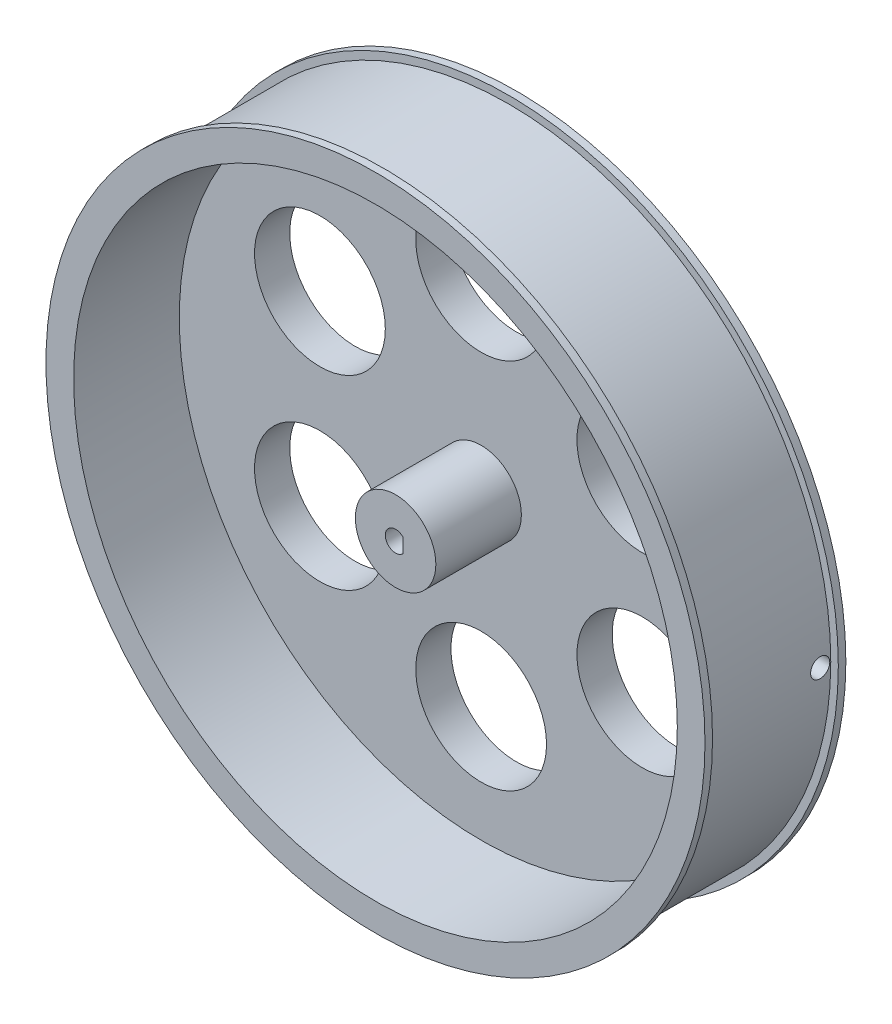
ISO-10303-21;
HEADER;
FILE_DESCRIPTION(('STEP AP214'),'2;1');
FILE_NAME('part.step','',(''),(''),'','','');
FILE_SCHEMA(('AUTOMOTIVE_DESIGN { 1 0 10303 214 1 1 1 1 }'));
ENDSEC;
DATA;
#1=APPLICATION_CONTEXT('core data for automotive mechanical design processes');
#2=APPLICATION_PROTOCOL_DEFINITION('international standard','automotive_design',2000,#1);
#3=PRODUCT_CONTEXT('',#1,'mechanical');
#4=PRODUCT('Part','Part','',(#3));
#5=PRODUCT_RELATED_PRODUCT_CATEGORY('part','',(#4));
#6=PRODUCT_DEFINITION_FORMATION('','',#4);
#7=PRODUCT_DEFINITION_CONTEXT('part definition',#1,'design');
#8=PRODUCT_DEFINITION('design','',#6,#7);
#9=PRODUCT_DEFINITION_SHAPE('','',#8);
#10=(LENGTH_UNIT() NAMED_UNIT(*) SI_UNIT(.MILLI.,.METRE.));
#11=(NAMED_UNIT(*) PLANE_ANGLE_UNIT() SI_UNIT($,.RADIAN.));
#12=(NAMED_UNIT(*) SI_UNIT($,.STERADIAN.) SOLID_ANGLE_UNIT());
#13=UNCERTAINTY_MEASURE_WITH_UNIT(LENGTH_MEASURE(1.E-05),#10,'distance_accuracy_value','');
#14=(GEOMETRIC_REPRESENTATION_CONTEXT(3) GLOBAL_UNCERTAINTY_ASSIGNED_CONTEXT((#13)) GLOBAL_UNIT_ASSIGNED_CONTEXT((#10,
#11,#12)) REPRESENTATION_CONTEXT('',''));
#15=CARTESIAN_POINT('',(0.,0.,0.));
#16=DIRECTION('',(0.,0.,1.));
#17=DIRECTION('',(1.,0.,0.));
#18=AXIS2_PLACEMENT_3D('',#15,#16,#17);
#19=CARTESIAN_POINT('',(0.,0.,28.));
#20=DIRECTION('',(0.,0.,-1.));
#21=DIRECTION('',(-1.,0.,0.));
#22=AXIS2_PLACEMENT_3D('',#19,#20,#21);
#23=CYLINDRICAL_SURFACE('',#22,64.);
#24=CARTESIAN_POINT('',(0.,0.,1.5));
#25=DIRECTION('',(0.,0.,1.));
#26=DIRECTION('',(1.,0.,0.));
#27=AXIS2_PLACEMENT_3D('',#24,#25,#26);
#28=CIRCLE('',#27,64.);
#29=CARTESIAN_POINT('',(64.,0.,1.5));
#30=VERTEX_POINT('',#29);
#31=EDGE_CURVE('E115',#30,#30,#28,.T.);
#32=ORIENTED_EDGE('',*,*,#31,.T.);
#33=EDGE_LOOP('',(#32));
#34=FACE_BOUND('',#33,.T.);
#35=CARTESIAN_POINT('',(0.,0.,26.5));
#36=DIRECTION('',(0.,0.,1.));
#37=DIRECTION('',(1.,0.,0.));
#38=AXIS2_PLACEMENT_3D('',#35,#36,#37);
#39=CIRCLE('',#38,64.);
#40=CARTESIAN_POINT('',(64.,0.,26.5));
#41=VERTEX_POINT('',#40);
#42=EDGE_CURVE('E116',#41,#41,#39,.T.);
#43=ORIENTED_EDGE('',*,*,#42,.F.);
#44=EDGE_LOOP('',(#43));
#45=FACE_BOUND('',#44,.T.);
#46=CARTESIAN_POINT('',(64.,0.,5.5));
#47=CARTESIAN_POINT('',(63.9999996199994,-0.106698612345607,5.49999527608061));
#48=CARTESIAN_POINT('',(63.9997303111057,-0.213473992693703,5.49098199431522));
#49=CARTESIAN_POINT('',(63.9986818741941,-0.424082374028197,5.45515226980288));
#50=CARTESIAN_POINT('',(63.9979021371134,-0.527911705051908,5.42831455769016));
#51=CARTESIAN_POINT('',(63.9959211475545,-0.72954643512145,5.35760220562604));
#52=CARTESIAN_POINT('',(63.9947201012045,-0.827354752525751,5.31373589589952));
#53=CARTESIAN_POINT('',(63.992031970981,-1.01419188196472,5.21022348904253));
#54=CARTESIAN_POINT('',(63.9905449569841,-1.10322283074151,5.15058124545399));
#55=CARTESIAN_POINT('',(63.9874515815209,-1.27004538019352,5.01717851573469));
#56=CARTESIAN_POINT('',(63.9858451749512,-1.34783270032114,4.94341267734249));
#57=CARTESIAN_POINT('',(63.9826944645377,-1.48992390514263,4.78386598718598));
#58=CARTESIAN_POINT('',(63.9811501631684,-1.5542272529904,4.69808465726786));
#59=CARTESIAN_POINT('',(63.9782975894916,-1.66753171355214,4.51692630096137));
#60=CARTESIAN_POINT('',(63.9769893564606,-1.71653028087621,4.42154768189913));
#61=CARTESIAN_POINT('',(63.9747568535961,-1.79781771133189,4.22391355579053));
#62=CARTESIAN_POINT('',(63.9738325822384,-1.83010664079925,4.1216580760465));
#63=CARTESIAN_POINT('',(63.9724725474494,-1.87704909606199,3.91320499276548));
#64=CARTESIAN_POINT('',(63.9720366391171,-1.89170785295673,3.80700856820308));
#65=CARTESIAN_POINT('',(63.9717020450109,-1.90298996714018,3.5936614448837));
#66=CARTESIAN_POINT('',(63.9718033571168,-1.89961339560664,3.48651074989449));
#67=CARTESIAN_POINT('',(63.9725316441729,-1.87492512980514,3.27433219245221));
#68=CARTESIAN_POINT('',(63.973158453323,-1.85361909247487,3.16930367113238));
#69=CARTESIAN_POINT('',(63.9748668133079,-1.793685444515,2.96431477686415));
#70=CARTESIAN_POINT('',(63.9759483651329,-1.75505779616508,2.86435441495292));
#71=CARTESIAN_POINT('',(63.9784444790023,-1.6615709348067,2.67232116840527));
#72=CARTESIAN_POINT('',(63.9798590942345,-1.60670912896074,2.58024954675));
#73=CARTESIAN_POINT('',(63.9828618091305,-1.48231321132906,2.40662122494208));
#74=CARTESIAN_POINT('',(63.9844499091809,-1.41277906683822,2.32506454822823));
#75=CARTESIAN_POINT('',(63.9876213051663,-1.26098029035961,2.17474825428561));
#76=CARTESIAN_POINT('',(63.9892045990093,-1.17871075242353,2.1059935912477));
#77=CARTESIAN_POINT('',(63.9921873051645,-1.00379383541694,1.98327117025075));
#78=CARTESIAN_POINT('',(63.9935867174473,-0.911146454671986,1.92930341467756));
#79=CARTESIAN_POINT('',(63.9960439274215,-0.718101037229735,1.83768732082399));
#80=CARTESIAN_POINT('',(63.9971017218578,-0.617702926688438,1.80003913804868));
#81=CARTESIAN_POINT('',(63.9987564024227,-0.412007241452619,1.74213405226947));
#82=CARTESIAN_POINT('',(63.9993532897805,-0.306709679823791,1.72187710289001));
#83=CARTESIAN_POINT('',(64.000018714961,-0.0942471702280073,1.69933557760619));
#84=CARTESIAN_POINT('',(64.0000874542976,0.0129170498759254,1.69704414699207));
#85=CARTESIAN_POINT('',(63.9996893685882,0.226108663191,1.71048084208262));
#86=CARTESIAN_POINT('',(63.9992225441496,0.332136057691051,1.72620894735491));
#87=CARTESIAN_POINT('',(63.9978060729454,0.540025161753835,1.77523257566562));
#88=CARTESIAN_POINT('',(63.9968565117124,0.641887605820601,1.80852498665189));
#89=CARTESIAN_POINT('',(63.9945815693909,0.838577839143948,1.89172901309807));
#90=CARTESIAN_POINT('',(63.9932561875643,0.933405614584978,1.94164066119583));
#91=CARTESIAN_POINT('',(63.9903784107815,1.11336623529374,2.05668399680052));
#92=CARTESIAN_POINT('',(63.9888259470702,1.19849613033198,2.12182029756429));
#93=CARTESIAN_POINT('',(63.9856691994091,1.35661482842624,2.26545717996146));
#94=CARTESIAN_POINT('',(63.9840649153291,1.42960360099844,2.34395779514886));
#95=CARTESIAN_POINT('',(63.9809848093217,1.56139104567387,2.51212432560449));
#96=CARTESIAN_POINT('',(63.9795090275302,1.62018529440946,2.60179370817698));
#97=CARTESIAN_POINT('',(63.9768529463871,1.72188448540472,2.78973467555335));
#98=CARTESIAN_POINT('',(63.9756726463773,1.76478946306328,2.88800624119227));
#99=CARTESIAN_POINT('',(63.9737408920934,1.83348445072033,3.09034534714766));
#100=CARTESIAN_POINT('',(63.972989366084,1.85927732374467,3.19441191474275));
#101=CARTESIAN_POINT('',(63.9719996911607,1.89302532388065,3.4054007473168));
#102=CARTESIAN_POINT('',(63.9717615418235,1.90098046569827,3.51232300994136));
#103=CARTESIAN_POINT('',(63.9718254969467,1.89882685216755,3.7259438002625));
#104=CARTESIAN_POINT('',(63.972127392715,1.88872507463918,3.83264239843933));
#105=CARTESIAN_POINT('',(63.9732369662478,1.85075872225259,4.04282849862724));
#106=CARTESIAN_POINT('',(63.9740446450153,1.82289411217036,4.14631599427022));
#107=CARTESIAN_POINT('',(63.9760747033709,1.7501940106501,4.34714497018357));
#108=CARTESIAN_POINT('',(63.9772970899118,1.70535823468446,4.44448634738018));
#109=CARTESIAN_POINT('',(63.9800187096145,1.5999909753816,4.63025806174355));
#110=CARTESIAN_POINT('',(63.9815179327465,1.53946006065691,4.71868872157179));
#111=CARTESIAN_POINT('',(63.9846247983773,1.40440041681556,4.88416073072506));
#112=CARTESIAN_POINT('',(63.9862324711014,1.32986777494589,4.96119888565792));
#113=CARTESIAN_POINT('',(63.9893751008632,1.16890523993306,5.10169011322));
#114=CARTESIAN_POINT('',(63.9909100397954,1.08247240521062,5.16513981701297));
#115=CARTESIAN_POINT('',(63.9937347008838,0.900129571652097,5.27666360279237));
#116=CARTESIAN_POINT('',(63.9950242643113,0.804213498837416,5.32472774578347));
#117=CARTESIAN_POINT('',(63.9972099587862,0.605743479037089,5.40401443328386));
#118=CARTESIAN_POINT('',(63.9981065588035,0.503197612887766,5.43525706313565));
#119=CARTESIAN_POINT('',(63.9991656406717,0.333336555604716,5.47173331156169));
#120=CARTESIAN_POINT('',(63.9994771680259,0.26712392271573,5.48231998426404));
#121=CARTESIAN_POINT('',(63.9998944669518,0.133950946908267,5.4964548104222));
#122=CARTESIAN_POINT('',(64.0000002385829,0.0669906042053914,5.5000029659075));
#123=CARTESIAN_POINT('',(64.,0.,5.5));
#124=B_SPLINE_CURVE_WITH_KNOTS('',3,(#46,#47,#48,#49,#50,#51,#52,#53,#54,#55,#56,#57,#58,#59,
#60,#61,#62,#63,#64,#65,#66,#67,#68,#69,#70,#71,#72,#73,#74,#75,#76,#77,#78,#79,#80,#81,#82,#83,
#84,#85,#86,#87,#88,#89,#90,#91,#92,#93,#94,#95,#96,#97,#98,#99,#100,#101,#102,#103,#104,#105,
#106,#107,#108,#109,#110,#111,#112,#113,#114,#115,#116,#117,#118,#119,#120,#121,#122,#123),
.UNSPECIFIED.,.T.,.F.,(4,2,2,2,2,2,2,2,2,2,2,2,2,2,2,2,2,2,2,2,2,2,2,2,2,2,2,2,2,2,2,2,2,2,2,2,
2,2,4),(0.,0.319851312799351,0.640084982098791,0.960162193204059,1.28016129205621,
1.6002818982838,1.92041524726091,2.24060181038508,2.56078710238796,2.88087736783342,
3.20096637002027,3.5209544185612,3.84094316392596,4.16098304388419,4.48102363722917,
4.80118782533059,5.12135206509002,5.44151935554613,5.76168579223955,6.08173006408592,
6.40177397303405,6.72176119548276,7.04174904634525,7.36183398344589,7.6819197242011,
8.00210508327793,8.32228972902593,8.64242079116892,8.96255158938567,9.28255870470103,
9.60256645459825,9.92257956977625,10.2425810929541,10.5626721732605,10.8828425186209,
11.2032192769713,11.523212643638,11.7240309898899,11.9248492782376),.UNSPECIFIED.);
#125=CARTESIAN_POINT('',(64.,0.,5.5));
#126=VERTEX_POINT('',#125);
#127=EDGE_CURVE('E43',#126,#126,#124,.T.);
#128=ORIENTED_EDGE('',*,*,#127,.F.);
#129=EDGE_LOOP('',(#128));
#130=FACE_BOUND('',#129,.T.);
#131=ADVANCED_FACE('F39',(#34,#45,#130),#23,.T.);
#132=CARTESIAN_POINT('',(9.,0.,3.6));
#133=DIRECTION('',(-1.,0.,0.));
#134=DIRECTION('',(0.,0.,1.));
#135=AXIS2_PLACEMENT_3D('',#132,#133,#134);
#136=CYLINDRICAL_SURFACE('',#135,1.3);
#137=CARTESIAN_POINT('',(1.5,0.,3.6));
#138=DIRECTION('',(-1.,0.,0.));
#139=DIRECTION('',(0.,-1.,0.));
#140=AXIS2_PLACEMENT_3D('',#137,#138,#139);
#141=CIRCLE('',#140,1.3);
#142=CARTESIAN_POINT('',(1.5,-1.3,3.6));
#143=VERTEX_POINT('',#142);
#144=EDGE_CURVE('E80',#143,#143,#141,.F.);
#145=ORIENTED_EDGE('',*,*,#144,.F.);
#146=EDGE_LOOP('',(#145));
#147=FACE_BOUND('',#146,.T.);
#148=CARTESIAN_POINT('',(8.5,0.,3.6));
#149=DIRECTION('',(1.,0.,0.));
#150=DIRECTION('',(0.,0.,-1.));
#151=AXIS2_PLACEMENT_3D('',#148,#149,#150);
#152=CIRCLE('',#151,1.3);
#153=CARTESIAN_POINT('',(8.5,0.,2.3));
#154=VERTEX_POINT('',#153);
#155=EDGE_CURVE('E120',#154,#154,#152,.T.);
#156=ORIENTED_EDGE('',*,*,#155,.T.);
#157=EDGE_LOOP('',(#156));
#158=FACE_BOUND('',#157,.T.);
#159=ADVANCED_FACE('F96',(#147,#158),#136,.F.);
#160=CARTESIAN_POINT('',(0.,0.,0.));
#161=DIRECTION('',(0.,0.,1.));
#162=DIRECTION('',(1.,0.,0.));
#163=AXIS2_PLACEMENT_3D('',#160,#161,#162);
#164=PLANE('',#163);
#165=CARTESIAN_POINT('',(0.,0.,0.));
#166=DIRECTION('',(0.,0.,1.));
#167=DIRECTION('',(1.,0.,0.));
#168=AXIS2_PLACEMENT_3D('',#165,#166,#167);
#169=CIRCLE('',#168,65.5);
#170=CARTESIAN_POINT('',(65.5,0.,0.));
#171=VERTEX_POINT('',#170);
#172=EDGE_CURVE('E170',#171,#171,#169,.T.);
#173=ORIENTED_EDGE('',*,*,#172,.F.);
#174=EDGE_LOOP('',(#173));
#175=FACE_BOUND('',#174,.T.);
#176=CARTESIAN_POINT('',(32.0429399400242,18.5,0.));
#177=DIRECTION('',(0.,0.,1.));
#178=DIRECTION('',(1.,0.,0.));
#179=AXIS2_PLACEMENT_3D('',#176,#177,#178);
#180=CIRCLE('',#179,13.);
#181=CARTESIAN_POINT('',(45.0429399400242,18.5,0.));
#182=VERTEX_POINT('',#181);
#183=EDGE_CURVE('E147',#182,#182,#180,.F.);
#184=ORIENTED_EDGE('',*,*,#183,.F.);
#185=EDGE_LOOP('',(#184));
#186=FACE_BOUND('',#185,.T.);
#187=CARTESIAN_POINT('',(0.,37.,0.));
#188=DIRECTION('',(0.,0.,1.));
#189=DIRECTION('',(1.,0.,0.));
#190=AXIS2_PLACEMENT_3D('',#187,#188,#189);
#191=CIRCLE('',#190,13.);
#192=CARTESIAN_POINT('',(13.,37.,0.));
#193=VERTEX_POINT('',#192);
#194=EDGE_CURVE('E148',#193,#193,#191,.F.);
#195=ORIENTED_EDGE('',*,*,#194,.F.);
#196=EDGE_LOOP('',(#195));
#197=FACE_BOUND('',#196,.T.);
#198=CARTESIAN_POINT('',(-32.0429399400242,18.5,0.));
#199=DIRECTION('',(0.,0.,1.));
#200=DIRECTION('',(1.,0.,0.));
#201=AXIS2_PLACEMENT_3D('',#198,#199,#200);
#202=CIRCLE('',#201,13.);
#203=CARTESIAN_POINT('',(-19.0429399400242,18.5,0.));
#204=VERTEX_POINT('',#203);
#205=EDGE_CURVE('E142',#204,#204,#202,.F.);
#206=ORIENTED_EDGE('',*,*,#205,.F.);
#207=EDGE_LOOP('',(#206));
#208=FACE_BOUND('',#207,.T.);
#209=CARTESIAN_POINT('',(-32.0429399400242,-18.5,0.));
#210=DIRECTION('',(0.,0.,1.));
#211=DIRECTION('',(1.,0.,0.));
#212=AXIS2_PLACEMENT_3D('',#209,#210,#211);
#213=CIRCLE('',#212,13.);
#214=CARTESIAN_POINT('',(-19.0429399400242,-18.5,0.));
#215=VERTEX_POINT('',#214);
#216=EDGE_CURVE('E140',#215,#215,#213,.F.);
#217=ORIENTED_EDGE('',*,*,#216,.F.);
#218=EDGE_LOOP('',(#217));
#219=FACE_BOUND('',#218,.T.);
#220=CARTESIAN_POINT('',(0.,-37.,0.));
#221=DIRECTION('',(0.,0.,1.));
#222=DIRECTION('',(1.,0.,0.));
#223=AXIS2_PLACEMENT_3D('',#220,#221,#222);
#224=CIRCLE('',#223,13.);
#225=CARTESIAN_POINT('',(13.,-37.,0.));
#226=VERTEX_POINT('',#225);
#227=EDGE_CURVE('E133',#226,#226,#224,.F.);
#228=ORIENTED_EDGE('',*,*,#227,.F.);
#229=EDGE_LOOP('',(#228));
#230=FACE_BOUND('',#229,.T.);
#231=CARTESIAN_POINT('',(32.0429399400242,-18.5,0.));
#232=DIRECTION('',(0.,0.,1.));
#233=DIRECTION('',(1.,0.,0.));
#234=AXIS2_PLACEMENT_3D('',#231,#232,#233);
#235=CIRCLE('',#234,13.);
#236=CARTESIAN_POINT('',(45.0429399400242,-18.5,0.));
#237=VERTEX_POINT('',#236);
#238=EDGE_CURVE('E134',#237,#237,#235,.F.);
#239=ORIENTED_EDGE('',*,*,#238,.F.);
#240=EDGE_LOOP('',(#239));
#241=FACE_BOUND('',#240,.T.);
#242=CARTESIAN_POINT('',(0.,0.,0.));
#243=DIRECTION('',(0.,0.,1.));
#244=DIRECTION('',(1.,0.,0.));
#245=AXIS2_PLACEMENT_3D('',#242,#243,#244);
#246=CIRCLE('',#245,2.05);
#247=CARTESIAN_POINT('',(1.5,-1.39731886124821,0.));
#248=VERTEX_POINT('',#247);
#249=CARTESIAN_POINT('',(1.5,1.39731886124821,0.));
#250=VERTEX_POINT('',#249);
#251=EDGE_CURVE('E79',#248,#250,#246,.F.);
#252=ORIENTED_EDGE('',*,*,#251,.F.);
#253=DIRECTION('',(0.,-1.,0.));
#254=VECTOR('',#253,1.);
#255=CARTESIAN_POINT('',(1.5,0.,0.));
#256=LINE('',#255,#254);
#257=EDGE_CURVE('E192',#250,#248,#256,.T.);
#258=ORIENTED_EDGE('',*,*,#257,.F.);
#259=EDGE_LOOP('',(#252,#258));
#260=FACE_BOUND('',#259,.T.);
#261=ADVANCED_FACE('F83',(#175,#186,#197,#208,#219,#230,#241,#260),#164,.F.);
#262=CARTESIAN_POINT('',(0.,0.,24.));
#263=DIRECTION('',(0.,0.,1.));
#264=DIRECTION('',(1.,0.,0.));
#265=AXIS2_PLACEMENT_3D('',#262,#263,#264);
#266=PLANE('',#265);
#267=CARTESIAN_POINT('',(0.,0.,24.));
#268=DIRECTION('',(0.,0.,1.));
#269=DIRECTION('',(1.,0.,0.));
#270=AXIS2_PLACEMENT_3D('',#267,#268,#269);
#271=CIRCLE('',#270,8.);
#272=CARTESIAN_POINT('',(8.,0.,24.));
#273=VERTEX_POINT('',#272);
#274=EDGE_CURVE('E158',#273,#273,#271,.T.);
#275=ORIENTED_EDGE('',*,*,#274,.T.);
#276=EDGE_LOOP('',(#275));
#277=FACE_BOUND('',#276,.T.);
#278=DIRECTION('',(0.,-1.,0.));
#279=VECTOR('',#278,1.);
#280=CARTESIAN_POINT('',(1.5,0.,24.));
#281=LINE('',#280,#279);
#282=CARTESIAN_POINT('',(1.5,1.39731886124821,24.));
#283=VERTEX_POINT('',#282);
#284=CARTESIAN_POINT('',(1.5,-1.39731886124821,24.));
#285=VERTEX_POINT('',#284);
#286=EDGE_CURVE('E55',#283,#285,#281,.T.);
#287=ORIENTED_EDGE('',*,*,#286,.T.);
#288=CARTESIAN_POINT('',(0.,0.,24.));
#289=DIRECTION('',(0.,0.,1.));
#290=DIRECTION('',(1.,0.,0.));
#291=AXIS2_PLACEMENT_3D('',#288,#289,#290);
#292=CIRCLE('',#291,2.05);
#293=EDGE_CURVE('E11',#285,#283,#292,.F.);
#294=ORIENTED_EDGE('',*,*,#293,.T.);
#295=EDGE_LOOP('',(#287,#294));
#296=FACE_BOUND('',#295,.T.);
#297=ADVANCED_FACE('F84',(#277,#296),#266,.T.);
#298=CARTESIAN_POINT('',(0.,0.,28.));
#299=DIRECTION('',(0.,0.,1.));
#300=DIRECTION('',(1.,0.,0.));
#301=AXIS2_PLACEMENT_3D('',#298,#299,#300);
#302=PLANE('',#301);
#303=CARTESIAN_POINT('',(0.,0.,28.));
#304=DIRECTION('',(0.,0.,1.));
#305=DIRECTION('',(1.,0.,0.));
#306=AXIS2_PLACEMENT_3D('',#303,#304,#305);
#307=CIRCLE('',#306,65.5);
#308=CARTESIAN_POINT('',(65.5,0.,28.));
#309=VERTEX_POINT('',#308);
#310=EDGE_CURVE('E168',#309,#309,#307,.T.);
#311=ORIENTED_EDGE('',*,*,#310,.T.);
#312=EDGE_LOOP('',(#311));
#313=FACE_BOUND('',#312,.T.);
#314=CARTESIAN_POINT('',(0.,0.,28.));
#315=DIRECTION('',(0.,0.,1.));
#316=DIRECTION('',(1.,0.,0.));
#317=AXIS2_PLACEMENT_3D('',#314,#315,#316);
#318=CIRCLE('',#317,60.);
#319=CARTESIAN_POINT('',(60.,0.,28.));
#320=VERTEX_POINT('',#319);
#321=EDGE_CURVE('E165',#320,#320,#318,.T.);
#322=ORIENTED_EDGE('',*,*,#321,.F.);
#323=EDGE_LOOP('',(#322));
#324=FACE_BOUND('',#323,.T.);
#325=ADVANCED_FACE('F81',(#313,#324),#302,.T.);
#326=CARTESIAN_POINT('',(0.,0.,28.));
#327=DIRECTION('',(0.,0.,-1.));
#328=DIRECTION('',(-1.,0.,0.));
#329=AXIS2_PLACEMENT_3D('',#326,#327,#328);
#330=CYLINDRICAL_SURFACE('',#329,60.);
#331=CARTESIAN_POINT('',(0.,0.,7.));
#332=DIRECTION('',(0.,0.,1.));
#333=DIRECTION('',(1.,0.,0.));
#334=AXIS2_PLACEMENT_3D('',#331,#332,#333);
#335=CIRCLE('',#334,60.);
#336=CARTESIAN_POINT('',(60.,0.,7.));
#337=VERTEX_POINT('',#336);
#338=EDGE_CURVE('E71',#337,#337,#335,.T.);
#339=ORIENTED_EDGE('',*,*,#338,.F.);
#340=EDGE_LOOP('',(#339));
#341=FACE_BOUND('',#340,.T.);
#342=ORIENTED_EDGE('',*,*,#321,.T.);
#343=EDGE_LOOP('',(#342));
#344=FACE_BOUND('',#343,.T.);
#345=ADVANCED_FACE('F91',(#341,#344),#330,.F.);
#346=CARTESIAN_POINT('',(0.,0.,1.5));
#347=DIRECTION('',(0.,0.,1.));
#348=DIRECTION('',(1.,0.,0.));
#349=AXIS2_PLACEMENT_3D('',#346,#347,#348);
#350=PLANE('',#349);
#351=ORIENTED_EDGE('',*,*,#31,.F.);
#352=EDGE_LOOP('',(#351));
#353=FACE_BOUND('',#352,.T.);
#354=CARTESIAN_POINT('',(0.,0.,1.5));
#355=DIRECTION('',(0.,0.,1.));
#356=DIRECTION('',(1.,0.,0.));
#357=AXIS2_PLACEMENT_3D('',#354,#355,#356);
#358=CIRCLE('',#357,65.5);
#359=CARTESIAN_POINT('',(65.5,0.,1.5));
#360=VERTEX_POINT('',#359);
#361=EDGE_CURVE('E163',#360,#360,#358,.T.);
#362=ORIENTED_EDGE('',*,*,#361,.T.);
#363=EDGE_LOOP('',(#362));
#364=FACE_BOUND('',#363,.T.);
#365=ADVANCED_FACE('F246',(#353,#364),#350,.T.);
#366=CARTESIAN_POINT('',(0.,0.,1.5));
#367=DIRECTION('',(0.,0.,-1.));
#368=DIRECTION('',(-1.,0.,0.));
#369=AXIS2_PLACEMENT_3D('',#366,#367,#368);
#370=CYLINDRICAL_SURFACE('',#369,65.5);
#371=ORIENTED_EDGE('',*,*,#361,.F.);
#372=EDGE_LOOP('',(#371));
#373=FACE_BOUND('',#372,.T.);
#374=ORIENTED_EDGE('',*,*,#172,.T.);
#375=EDGE_LOOP('',(#374));
#376=FACE_BOUND('',#375,.T.);
#377=ADVANCED_FACE('F260',(#373,#376),#370,.T.);
#378=CARTESIAN_POINT('',(0.,0.,26.5));
#379=DIRECTION('',(0.,0.,1.));
#380=DIRECTION('',(1.,0.,0.));
#381=AXIS2_PLACEMENT_3D('',#378,#379,#380);
#382=PLANE('',#381);
#383=ORIENTED_EDGE('',*,*,#42,.T.);
#384=EDGE_LOOP('',(#383));
#385=FACE_BOUND('',#384,.T.);
#386=CARTESIAN_POINT('',(0.,0.,26.5));
#387=DIRECTION('',(0.,0.,1.));
#388=DIRECTION('',(1.,0.,0.));
#389=AXIS2_PLACEMENT_3D('',#386,#387,#388);
#390=CIRCLE('',#389,65.5);
#391=CARTESIAN_POINT('',(65.5,0.,26.5));
#392=VERTEX_POINT('',#391);
#393=EDGE_CURVE('E160',#392,#392,#390,.T.);
#394=ORIENTED_EDGE('',*,*,#393,.F.);
#395=EDGE_LOOP('',(#394));
#396=FACE_BOUND('',#395,.T.);
#397=ADVANCED_FACE('F265',(#385,#396),#382,.F.);
#398=CARTESIAN_POINT('',(0.,0.,28.));
#399=DIRECTION('',(0.,0.,-1.));
#400=DIRECTION('',(-1.,0.,0.));
#401=AXIS2_PLACEMENT_3D('',#398,#399,#400);
#402=CYLINDRICAL_SURFACE('',#401,65.5);
#403=ORIENTED_EDGE('',*,*,#310,.F.);
#404=EDGE_LOOP('',(#403));
#405=FACE_BOUND('',#404,.T.);
#406=ORIENTED_EDGE('',*,*,#393,.T.);
#407=EDGE_LOOP('',(#406));
#408=FACE_BOUND('',#407,.T.);
#409=ADVANCED_FACE('F238',(#405,#408),#402,.T.);
#410=CARTESIAN_POINT('',(0.,0.,7.));
#411=DIRECTION('',(0.,0.,1.));
#412=DIRECTION('',(1.,0.,0.));
#413=AXIS2_PLACEMENT_3D('',#410,#411,#412);
#414=PLANE('',#413);
#415=CARTESIAN_POINT('',(32.0429399400242,-18.5,7.));
#416=DIRECTION('',(0.,0.,1.));
#417=DIRECTION('',(1.,0.,0.));
#418=AXIS2_PLACEMENT_3D('',#415,#416,#417);
#419=CIRCLE('',#418,13.);
#420=CARTESIAN_POINT('',(45.0429399400242,-18.5,7.));
#421=VERTEX_POINT('',#420);
#422=EDGE_CURVE('E128',#421,#421,#419,.F.);
#423=ORIENTED_EDGE('',*,*,#422,.T.);
#424=EDGE_LOOP('',(#423));
#425=FACE_BOUND('',#424,.T.);
#426=CARTESIAN_POINT('',(0.,-37.,7.));
#427=DIRECTION('',(0.,0.,1.));
#428=DIRECTION('',(1.,0.,0.));
#429=AXIS2_PLACEMENT_3D('',#426,#427,#428);
#430=CIRCLE('',#429,13.);
#431=CARTESIAN_POINT('',(13.,-37.,7.));
#432=VERTEX_POINT('',#431);
#433=EDGE_CURVE('E135',#432,#432,#430,.F.);
#434=ORIENTED_EDGE('',*,*,#433,.T.);
#435=EDGE_LOOP('',(#434));
#436=FACE_BOUND('',#435,.T.);
#437=CARTESIAN_POINT('',(-32.0429399400242,-18.5,7.));
#438=DIRECTION('',(0.,0.,1.));
#439=DIRECTION('',(1.,0.,0.));
#440=AXIS2_PLACEMENT_3D('',#437,#438,#439);
#441=CIRCLE('',#440,13.);
#442=CARTESIAN_POINT('',(-19.0429399400242,-18.5,7.));
#443=VERTEX_POINT('',#442);
#444=EDGE_CURVE('E136',#443,#443,#441,.F.);
#445=ORIENTED_EDGE('',*,*,#444,.T.);
#446=EDGE_LOOP('',(#445));
#447=FACE_BOUND('',#446,.T.);
#448=CARTESIAN_POINT('',(-32.0429399400242,18.5,7.));
#449=DIRECTION('',(0.,0.,1.));
#450=DIRECTION('',(1.,0.,0.));
#451=AXIS2_PLACEMENT_3D('',#448,#449,#450);
#452=CIRCLE('',#451,13.);
#453=CARTESIAN_POINT('',(-19.0429399400242,18.5,7.));
#454=VERTEX_POINT('',#453);
#455=EDGE_CURVE('E141',#454,#454,#452,.F.);
#456=ORIENTED_EDGE('',*,*,#455,.T.);
#457=EDGE_LOOP('',(#456));
#458=FACE_BOUND('',#457,.T.);
#459=CARTESIAN_POINT('',(0.,37.,7.));
#460=DIRECTION('',(0.,0.,1.));
#461=DIRECTION('',(1.,0.,0.));
#462=AXIS2_PLACEMENT_3D('',#459,#460,#461);
#463=CIRCLE('',#462,13.);
#464=CARTESIAN_POINT('',(13.,37.,7.));
#465=VERTEX_POINT('',#464);
#466=EDGE_CURVE('E150',#465,#465,#463,.F.);
#467=ORIENTED_EDGE('',*,*,#466,.T.);
#468=EDGE_LOOP('',(#467));
#469=FACE_BOUND('',#468,.T.);
#470=CARTESIAN_POINT('',(32.0429399400242,18.5,7.));
#471=DIRECTION('',(0.,0.,1.));
#472=DIRECTION('',(1.,0.,0.));
#473=AXIS2_PLACEMENT_3D('',#470,#471,#472);
#474=CIRCLE('',#473,13.);
#475=CARTESIAN_POINT('',(45.0429399400242,18.5,7.));
#476=VERTEX_POINT('',#475);
#477=EDGE_CURVE('E151',#476,#476,#474,.F.);
#478=ORIENTED_EDGE('',*,*,#477,.T.);
#479=EDGE_LOOP('',(#478));
#480=FACE_BOUND('',#479,.T.);
#481=CARTESIAN_POINT('',(0.,0.,7.));
#482=DIRECTION('',(0.,0.,1.));
#483=DIRECTION('',(1.,0.,0.));
#484=AXIS2_PLACEMENT_3D('',#481,#482,#483);
#485=CIRCLE('',#484,8.);
#486=CARTESIAN_POINT('',(8.,0.,7.));
#487=VERTEX_POINT('',#486);
#488=EDGE_CURVE('E152',#487,#487,#485,.F.);
#489=ORIENTED_EDGE('',*,*,#488,.T.);
#490=EDGE_LOOP('',(#489));
#491=FACE_BOUND('',#490,.T.);
#492=ORIENTED_EDGE('',*,*,#338,.T.);
#493=EDGE_LOOP('',(#492));
#494=FACE_BOUND('',#493,.T.);
#495=ADVANCED_FACE('F233',(#425,#436,#447,#458,#469,#480,#491,#494),#414,.T.);
#496=CARTESIAN_POINT('',(0.,0.,24.));
#497=DIRECTION('',(0.,0.,-1.));
#498=DIRECTION('',(-1.,0.,0.));
#499=AXIS2_PLACEMENT_3D('',#496,#497,#498);
#500=CYLINDRICAL_SURFACE('',#499,8.);
#501=ORIENTED_EDGE('',*,*,#488,.F.);
#502=EDGE_LOOP('',(#501));
#503=FACE_BOUND('',#502,.T.);
#504=ORIENTED_EDGE('',*,*,#274,.F.);
#505=EDGE_LOOP('',(#504));
#506=FACE_BOUND('',#505,.T.);
#507=ADVANCED_FACE('F223',(#503,#506),#500,.T.);
#508=CARTESIAN_POINT('',(32.0429399400242,18.5,8.));
#509=DIRECTION('',(0.,0.,-1.));
#510=DIRECTION('',(-1.,0.,0.));
#511=AXIS2_PLACEMENT_3D('',#508,#509,#510);
#512=CYLINDRICAL_SURFACE('',#511,13.);
#513=ORIENTED_EDGE('',*,*,#477,.F.);
#514=EDGE_LOOP('',(#513));
#515=FACE_BOUND('',#514,.T.);
#516=ORIENTED_EDGE('',*,*,#183,.T.);
#517=EDGE_LOOP('',(#516));
#518=FACE_BOUND('',#517,.T.);
#519=ADVANCED_FACE('F198',(#515,#518),#512,.F.);
#520=CARTESIAN_POINT('',(0.,37.,8.));
#521=DIRECTION('',(0.,0.,-1.));
#522=DIRECTION('',(-1.,0.,0.));
#523=AXIS2_PLACEMENT_3D('',#520,#521,#522);
#524=CYLINDRICAL_SURFACE('',#523,13.);
#525=ORIENTED_EDGE('',*,*,#466,.F.);
#526=EDGE_LOOP('',(#525));
#527=FACE_BOUND('',#526,.T.);
#528=ORIENTED_EDGE('',*,*,#194,.T.);
#529=EDGE_LOOP('',(#528));
#530=FACE_BOUND('',#529,.T.);
#531=ADVANCED_FACE('F221',(#527,#530),#524,.F.);
#532=CARTESIAN_POINT('',(-32.0429399400242,18.5,8.));
#533=DIRECTION('',(0.,0.,-1.));
#534=DIRECTION('',(-1.,0.,0.));
#535=AXIS2_PLACEMENT_3D('',#532,#533,#534);
#536=CYLINDRICAL_SURFACE('',#535,13.);
#537=ORIENTED_EDGE('',*,*,#455,.F.);
#538=EDGE_LOOP('',(#537));
#539=FACE_BOUND('',#538,.T.);
#540=ORIENTED_EDGE('',*,*,#205,.T.);
#541=EDGE_LOOP('',(#540));
#542=FACE_BOUND('',#541,.T.);
#543=ADVANCED_FACE('F232',(#539,#542),#536,.F.);
#544=CARTESIAN_POINT('',(-32.0429399400242,-18.5,8.));
#545=DIRECTION('',(0.,0.,-1.));
#546=DIRECTION('',(-1.,0.,0.));
#547=AXIS2_PLACEMENT_3D('',#544,#545,#546);
#548=CYLINDRICAL_SURFACE('',#547,13.);
#549=ORIENTED_EDGE('',*,*,#444,.F.);
#550=EDGE_LOOP('',(#549));
#551=FACE_BOUND('',#550,.T.);
#552=ORIENTED_EDGE('',*,*,#216,.T.);
#553=EDGE_LOOP('',(#552));
#554=FACE_BOUND('',#553,.T.);
#555=ADVANCED_FACE('F217',(#551,#554),#548,.F.);
#556=CARTESIAN_POINT('',(0.,-37.,8.));
#557=DIRECTION('',(0.,0.,-1.));
#558=DIRECTION('',(-1.,0.,0.));
#559=AXIS2_PLACEMENT_3D('',#556,#557,#558);
#560=CYLINDRICAL_SURFACE('',#559,13.);
#561=ORIENTED_EDGE('',*,*,#433,.F.);
#562=EDGE_LOOP('',(#561));
#563=FACE_BOUND('',#562,.T.);
#564=ORIENTED_EDGE('',*,*,#227,.T.);
#565=EDGE_LOOP('',(#564));
#566=FACE_BOUND('',#565,.T.);
#567=ADVANCED_FACE('F211',(#563,#566),#560,.F.);
#568=CARTESIAN_POINT('',(32.0429399400242,-18.5,8.));
#569=DIRECTION('',(0.,0.,-1.));
#570=DIRECTION('',(-1.,0.,0.));
#571=AXIS2_PLACEMENT_3D('',#568,#569,#570);
#572=CYLINDRICAL_SURFACE('',#571,13.);
#573=ORIENTED_EDGE('',*,*,#422,.F.);
#574=EDGE_LOOP('',(#573));
#575=FACE_BOUND('',#574,.T.);
#576=ORIENTED_EDGE('',*,*,#238,.T.);
#577=EDGE_LOOP('',(#576));
#578=FACE_BOUND('',#577,.T.);
#579=ADVANCED_FACE('F207',(#575,#578),#572,.F.);
#580=CARTESIAN_POINT('',(0.,0.,29.));
#581=DIRECTION('',(0.,0.,-1.));
#582=DIRECTION('',(-1.,0.,0.));
#583=AXIS2_PLACEMENT_3D('',#580,#581,#582);
#584=CYLINDRICAL_SURFACE('',#583,2.05);
#585=ORIENTED_EDGE('',*,*,#251,.T.);
#586=DIRECTION('',(0.,0.,-1.));
#587=VECTOR('',#586,1.);
#588=CARTESIAN_POINT('',(1.5,1.39731886124821,29.));
#589=LINE('',#588,#587);
#590=EDGE_CURVE('E58',#283,#250,#589,.T.);
#591=ORIENTED_EDGE('',*,*,#590,.F.);
#592=ORIENTED_EDGE('',*,*,#293,.F.);
#593=DIRECTION('',(0.,0.,-1.));
#594=VECTOR('',#593,1.);
#595=CARTESIAN_POINT('',(1.5,-1.39731886124821,29.));
#596=LINE('',#595,#594);
#597=EDGE_CURVE('E65',#285,#248,#596,.T.);
#598=ORIENTED_EDGE('',*,*,#597,.T.);
#599=EDGE_LOOP('',(#585,#591,#592,#598));
#600=FACE_BOUND('',#599,.T.);
#601=ADVANCED_FACE('F76',(#600),#584,.F.);
#602=CARTESIAN_POINT('',(1.5,-1.39731886124821,29.));
#603=DIRECTION('',(-1.,0.,0.));
#604=DIRECTION('',(0.,-1.,0.));
#605=AXIS2_PLACEMENT_3D('',#602,#603,#604);
#606=PLANE('',#605);
#607=ORIENTED_EDGE('',*,*,#144,.T.);
#608=EDGE_LOOP('',(#607));
#609=FACE_BOUND('',#608,.T.);
#610=ORIENTED_EDGE('',*,*,#257,.T.);
#611=ORIENTED_EDGE('',*,*,#597,.F.);
#612=ORIENTED_EDGE('',*,*,#286,.F.);
#613=ORIENTED_EDGE('',*,*,#590,.T.);
#614=EDGE_LOOP('',(#610,#611,#612,#613));
#615=FACE_BOUND('',#614,.T.);
#616=ADVANCED_FACE('F72',(#609,#615),#606,.T.);
#617=CARTESIAN_POINT('',(66.,0.,3.6));
#618=DIRECTION('',(-1.,0.,0.));
#619=DIRECTION('',(0.,0.,1.));
#620=AXIS2_PLACEMENT_3D('',#617,#618,#619);
#621=CYLINDRICAL_SURFACE('',#620,1.9);
#622=CARTESIAN_POINT('',(8.5,0.,3.6));
#623=DIRECTION('',(1.,0.,0.));
#624=DIRECTION('',(0.,0.,-1.));
#625=AXIS2_PLACEMENT_3D('',#622,#623,#624);
#626=CIRCLE('',#625,1.9);
#627=CARTESIAN_POINT('',(8.5,0.,1.7));
#628=VERTEX_POINT('',#627);
#629=EDGE_CURVE('E121',#628,#628,#626,.T.);
#630=ORIENTED_EDGE('',*,*,#629,.F.);
#631=EDGE_LOOP('',(#630));
#632=FACE_BOUND('',#631,.T.);
#633=ORIENTED_EDGE('',*,*,#127,.T.);
#634=EDGE_LOOP('',(#633));
#635=FACE_BOUND('',#634,.T.);
#636=ADVANCED_FACE('F358',(#632,#635),#621,.F.);
#637=CARTESIAN_POINT('',(8.5,0.,3.6));
#638=DIRECTION('',(1.,0.,0.));
#639=DIRECTION('',(0.,0.,-1.));
#640=AXIS2_PLACEMENT_3D('',#637,#638,#639);
#641=PLANE('',#640);
#642=ORIENTED_EDGE('',*,*,#155,.F.);
#643=EDGE_LOOP('',(#642));
#644=FACE_BOUND('',#643,.T.);
#645=ORIENTED_EDGE('',*,*,#629,.T.);
#646=EDGE_LOOP('',(#645));
#647=FACE_BOUND('',#646,.T.);
#648=ADVANCED_FACE('F377',(#644,#647),#641,.T.);
#649=CLOSED_SHELL('',(#131,#159,#261,#297,#325,#345,#365,#377,#397,#409,#495,#507,#519,#531,
#543,#555,#567,#579,#601,#616,#636,#648));
#650=MANIFOLD_SOLID_BREP('B2',#649);
#651=ADVANCED_BREP_SHAPE_REPRESENTATION('',(#18,#650),#14);
#652=SHAPE_DEFINITION_REPRESENTATION(#9,#651);
ENDSEC;
END-ISO-10303-21;
